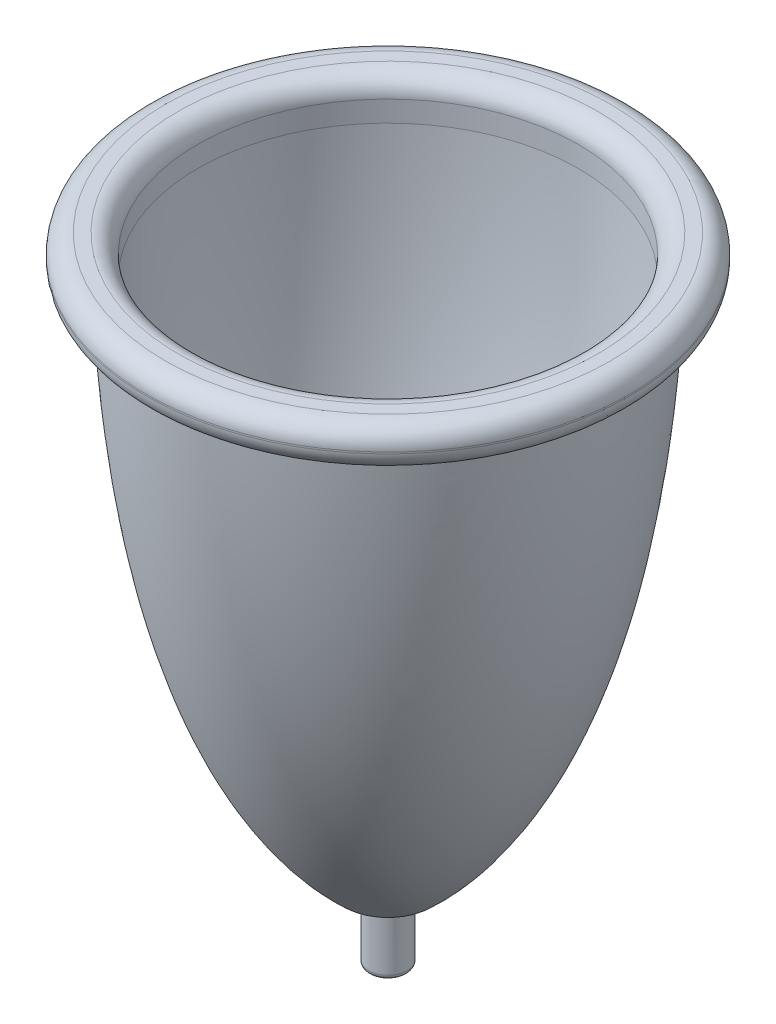
ISO-10303-21;
HEADER;
FILE_DESCRIPTION(('STEP AP214'),'2;1');
FILE_NAME('part.step','',(''),(''),'','','');
FILE_SCHEMA(('AUTOMOTIVE_DESIGN { 1 0 10303 214 1 1 1 1 }'));
ENDSEC;
DATA;
#1=APPLICATION_CONTEXT('core data for automotive mechanical design processes');
#2=APPLICATION_PROTOCOL_DEFINITION('international standard','automotive_design',2000,#1);
#3=PRODUCT_CONTEXT('',#1,'mechanical');
#4=PRODUCT('Part','Part','',(#3));
#5=PRODUCT_RELATED_PRODUCT_CATEGORY('part','',(#4));
#6=PRODUCT_DEFINITION_FORMATION('','',#4);
#7=PRODUCT_DEFINITION_CONTEXT('part definition',#1,'design');
#8=PRODUCT_DEFINITION('design','',#6,#7);
#9=PRODUCT_DEFINITION_SHAPE('','',#8);
#10=(LENGTH_UNIT() NAMED_UNIT(*) SI_UNIT(.MILLI.,.METRE.));
#11=(NAMED_UNIT(*) PLANE_ANGLE_UNIT() SI_UNIT($,.RADIAN.));
#12=(NAMED_UNIT(*) SI_UNIT($,.STERADIAN.) SOLID_ANGLE_UNIT());
#13=UNCERTAINTY_MEASURE_WITH_UNIT(LENGTH_MEASURE(1.E-05),#10,'distance_accuracy_value','');
#14=(GEOMETRIC_REPRESENTATION_CONTEXT(3) GLOBAL_UNCERTAINTY_ASSIGNED_CONTEXT((#13)) GLOBAL_UNIT_ASSIGNED_CONTEXT((#10,
#11,#12)) REPRESENTATION_CONTEXT('',''));
#15=CARTESIAN_POINT('',(0.,0.,0.));
#16=DIRECTION('',(0.,0.,1.));
#17=DIRECTION('',(1.,0.,0.));
#18=AXIS2_PLACEMENT_3D('',#15,#16,#17);
#19=CARTESIAN_POINT('',(0.,55.3992159475314,-21.8706627184148));
#20=CARTESIAN_POINT('',(0.,14.1955587357399,-20.3266568097654));
#21=CARTESIAN_POINT('',(0.,0.,-4.));
#22=B_SPLINE_CURVE_WITH_KNOTS('',2,(#19,#20,#21),.UNSPECIFIED.,.F.,.F.,(3,3),(0.,1.),.UNSPECIFIED.);
#23=CARTESIAN_POINT('',(0.,-7.,0.));
#24=DIRECTION('',(0.,-1.,0.));
#25=AXIS1_PLACEMENT('',#23,#24);
#26=SURFACE_OF_REVOLUTION('',#22,#25);
#27=CARTESIAN_POINT('',(0.,54.3543562152603,0.));
#28=DIRECTION('',(0.,-1.,0.));
#29=DIRECTION('',(0.,0.,-1.));
#30=AXIS2_PLACEMENT_3D('',#27,#28,#29);
#31=CIRCLE('',#30,21.8289486440233);
#32=CARTESIAN_POINT('',(0.,54.3543562152603,-21.8289486440233));
#33=VERTEX_POINT('',#32);
#34=EDGE_CURVE('E40',#33,#33,#31,.T.);
#35=ORIENTED_EDGE('',*,*,#34,.T.);
#36=EDGE_LOOP('',(#35));
#37=FACE_BOUND('',#36,.T.);
#38=CARTESIAN_POINT('',(0.,0.524112621067131,0.));
#39=DIRECTION('',(0.,-1.,0.));
#40=DIRECTION('',(0.,0.,-1.));
#41=AXIS2_PLACEMENT_3D('',#38,#39,#40);
#42=CIRCLE('',#41,4.58769688802162);
#43=CARTESIAN_POINT('',(0.,0.524112621067131,-4.58769688802162));
#44=VERTEX_POINT('',#43);
#45=EDGE_CURVE('E53',#44,#44,#42,.F.);
#46=ORIENTED_EDGE('',*,*,#45,.T.);
#47=EDGE_LOOP('',(#46));
#48=FACE_BOUND('',#47,.T.);
#49=ADVANCED_FACE('F33',(#37,#48),#26,.T.);
#50=CARTESIAN_POINT('',(0.,54.8331780654649,-5.70259197723976E-13));
#51=DIRECTION('',(0.,1.,0.));
#52=DIRECTION('',(0.,0.,1.));
#53=AXIS2_PLACEMENT_3D('',#50,#51,#52);
#54=PLANE('',#53);
#55=CARTESIAN_POINT('',(0.,54.8331780654649,0.));
#56=DIRECTION('',(0.,1.,0.));
#57=DIRECTION('',(0.,0.,1.));
#58=AXIS2_PLACEMENT_3D('',#55,#56,#57);
#59=CIRCLE('',#58,22.3284999286491);
#60=CARTESIAN_POINT('',(0.,54.8331780654649,22.3284999286491));
#61=VERTEX_POINT('',#60);
#62=EDGE_CURVE('E10',#61,#61,#59,.T.);
#63=ORIENTED_EDGE('',*,*,#62,.T.);
#64=EDGE_LOOP('',(#63));
#65=FACE_BOUND('',#64,.T.);
#66=CARTESIAN_POINT('',(0.,54.833178065465,0.));
#67=DIRECTION('',(0.,-1.,0.));
#68=DIRECTION('',(0.,0.,-1.));
#69=AXIS2_PLACEMENT_3D('',#66,#67,#68);
#70=CIRCLE('',#69,23.1470787081715);
#71=CARTESIAN_POINT('',(0.,54.833178065465,-23.1470787081715));
#72=VERTEX_POINT('',#71);
#73=EDGE_CURVE('E59',#72,#72,#70,.T.);
#74=ORIENTED_EDGE('',*,*,#73,.T.);
#75=EDGE_LOOP('',(#74));
#76=FACE_BOUND('',#75,.T.);
#77=ADVANCED_FACE('F127',(#65,#76),#54,.F.);
#78=CARTESIAN_POINT('',(0.,56.833178065465,0.));
#79=DIRECTION('',(0.,-1.,0.));
#80=DIRECTION('',(0.,0.,-1.));
#81=AXIS2_PLACEMENT_3D('',#78,#79,#80);
#82=TOROIDAL_SURFACE('',#81,23.1470787081715,2.);
#83=ORIENTED_EDGE('',*,*,#73,.F.);
#84=EDGE_LOOP('',(#83));
#85=FACE_BOUND('',#84,.T.);
#86=CARTESIAN_POINT('',(0.,56.833178065465,0.));
#87=DIRECTION('',(0.,-1.,0.));
#88=DIRECTION('',(0.,0.,-1.));
#89=AXIS2_PLACEMENT_3D('',#86,#87,#88);
#90=CIRCLE('',#89,25.1470787081715);
#91=CARTESIAN_POINT('',(0.,56.833178065465,-25.1470787081715));
#92=VERTEX_POINT('',#91);
#93=EDGE_CURVE('E62',#92,#92,#90,.T.);
#94=ORIENTED_EDGE('',*,*,#93,.T.);
#95=EDGE_LOOP('',(#94));
#96=FACE_BOUND('',#95,.T.);
#97=ADVANCED_FACE('F123',(#85,#96),#82,.T.);
#98=CARTESIAN_POINT('',(0.,-7.,0.));
#99=DIRECTION('',(0.,-1.,0.));
#100=DIRECTION('',(0.,0.,-1.));
#101=AXIS2_PLACEMENT_3D('',#98,#99,#100);
#102=CYLINDRICAL_SURFACE('',#101,25.1470787081715);
#103=CARTESIAN_POINT('',(0.,57.,0.));
#104=DIRECTION('',(0.,-1.,0.));
#105=DIRECTION('',(0.,0.,-1.));
#106=AXIS2_PLACEMENT_3D('',#103,#104,#105);
#107=CIRCLE('',#106,25.1470787081715);
#108=CARTESIAN_POINT('',(0.,57.,-25.1470787081715));
#109=VERTEX_POINT('',#108);
#110=EDGE_CURVE('E65',#109,#109,#107,.T.);
#111=ORIENTED_EDGE('',*,*,#110,.T.);
#112=EDGE_LOOP('',(#111));
#113=FACE_BOUND('',#112,.T.);
#114=ORIENTED_EDGE('',*,*,#93,.F.);
#115=EDGE_LOOP('',(#114));
#116=FACE_BOUND('',#115,.T.);
#117=ADVANCED_FACE('F119',(#113,#116),#102,.T.);
#118=CARTESIAN_POINT('',(0.,57.,0.));
#119=DIRECTION('',(0.,-1.,0.));
#120=DIRECTION('',(0.,0.,-1.));
#121=AXIS2_PLACEMENT_3D('',#118,#119,#120);
#122=TOROIDAL_SURFACE('',#121,23.1470787081715,2.);
#123=CARTESIAN_POINT('',(0.,59.,0.));
#124=DIRECTION('',(0.,-1.,0.));
#125=DIRECTION('',(0.,0.,-1.));
#126=AXIS2_PLACEMENT_3D('',#123,#124,#125);
#127=CIRCLE('',#126,23.1470787081715);
#128=CARTESIAN_POINT('',(0.,59.,-23.1470787081715));
#129=VERTEX_POINT('',#128);
#130=EDGE_CURVE('E68',#129,#129,#127,.T.);
#131=ORIENTED_EDGE('',*,*,#130,.T.);
#132=EDGE_LOOP('',(#131));
#133=FACE_BOUND('',#132,.T.);
#134=ORIENTED_EDGE('',*,*,#110,.F.);
#135=EDGE_LOOP('',(#134));
#136=FACE_BOUND('',#135,.T.);
#137=ADVANCED_FACE('F115',(#133,#136),#122,.T.);
#138=CARTESIAN_POINT('',(0.,59.,0.));
#139=DIRECTION('',(0.,-1.,0.));
#140=DIRECTION('',(0.,0.,-1.));
#141=AXIS2_PLACEMENT_3D('',#138,#139,#140);
#142=PLANE('',#141);
#143=ORIENTED_EDGE('',*,*,#130,.F.);
#144=EDGE_LOOP('',(#143));
#145=FACE_BOUND('',#144,.T.);
#146=CARTESIAN_POINT('',(0.,59.,0.));
#147=DIRECTION('',(0.,-1.,0.));
#148=DIRECTION('',(0.,0.,-1.));
#149=AXIS2_PLACEMENT_3D('',#146,#147,#148);
#150=CIRCLE('',#149,21.8470787081715);
#151=CARTESIAN_POINT('',(0.,59.,-21.8470787081715));
#152=VERTEX_POINT('',#151);
#153=EDGE_CURVE('E71',#152,#152,#150,.T.);
#154=ORIENTED_EDGE('',*,*,#153,.T.);
#155=EDGE_LOOP('',(#154));
#156=FACE_BOUND('',#155,.T.);
#157=ADVANCED_FACE('F111',(#145,#156),#142,.F.);
#158=CARTESIAN_POINT('',(0.,57.,0.));
#159=DIRECTION('',(0.,-1.,0.));
#160=DIRECTION('',(0.,0.,-1.));
#161=AXIS2_PLACEMENT_3D('',#158,#159,#160);
#162=TOROIDAL_SURFACE('',#161,21.8470787081715,2.);
#163=ORIENTED_EDGE('',*,*,#153,.F.);
#164=EDGE_LOOP('',(#163));
#165=FACE_BOUND('',#164,.T.);
#166=CARTESIAN_POINT('',(0.,57.,0.));
#167=DIRECTION('',(0.,-1.,0.));
#168=DIRECTION('',(0.,0.,-1.));
#169=AXIS2_PLACEMENT_3D('',#166,#167,#168);
#170=CIRCLE('',#169,19.8470787081715);
#171=CARTESIAN_POINT('',(0.,57.,-19.8470787081715));
#172=VERTEX_POINT('',#171);
#173=EDGE_CURVE('E74',#172,#172,#170,.T.);
#174=ORIENTED_EDGE('',*,*,#173,.T.);
#175=EDGE_LOOP('',(#174));
#176=FACE_BOUND('',#175,.T.);
#177=ADVANCED_FACE('F107',(#165,#176),#162,.T.);
#178=CARTESIAN_POINT('',(0.,-7.,0.));
#179=DIRECTION('',(0.,-1.,0.));
#180=DIRECTION('',(0.,0.,-1.));
#181=AXIS2_PLACEMENT_3D('',#178,#179,#180);
#182=CYLINDRICAL_SURFACE('',#181,19.8470787081715);
#183=ORIENTED_EDGE('',*,*,#173,.F.);
#184=EDGE_LOOP('',(#183));
#185=FACE_BOUND('',#184,.T.);
#186=CARTESIAN_POINT('',(0.,54.833178065465,0.));
#187=DIRECTION('',(0.,-1.,0.));
#188=DIRECTION('',(0.,0.,-1.));
#189=AXIS2_PLACEMENT_3D('',#186,#187,#188);
#190=CIRCLE('',#189,19.8470787081715);
#191=CARTESIAN_POINT('',(0.,54.833178065465,-19.8470787081715));
#192=VERTEX_POINT('',#191);
#193=EDGE_CURVE('E77',#192,#192,#190,.T.);
#194=ORIENTED_EDGE('',*,*,#193,.T.);
#195=EDGE_LOOP('',(#194));
#196=FACE_BOUND('',#195,.T.);
#197=ADVANCED_FACE('F102',(#185,#196),#182,.F.);
#198=CARTESIAN_POINT('',(0.,54.833178065465,-19.8470787081715));
#199=CARTESIAN_POINT('',(0.,54.0175401638276,-19.8140408573866));
#200=CARTESIAN_POINT('',(0.,52.3746515404192,-19.7377815935634));
#201=CARTESIAN_POINT('',(0.,49.1868341109516,-19.5504244417606));
#202=CARTESIAN_POINT('',(0.,45.3193799848925,-19.2483111294498));
#203=CARTESIAN_POINT('',(0.,40.8873799013585,-18.7783231518596));
#204=CARTESIAN_POINT('',(0.,35.249773199393,-18.0087211678712));
#205=CARTESIAN_POINT('',(0.,28.7167391183524,-16.7801766602839));
#206=CARTESIAN_POINT('',(0.,21.7015524838969,-14.8852277279257));
#207=CARTESIAN_POINT('',(0.,15.5137307059156,-12.5785372371585));
#208=CARTESIAN_POINT('',(0.,10.1511021048624,-9.86987494169743));
#209=CARTESIAN_POINT('',(0.,6.36846408827015,-7.29301955773348));
#210=CARTESIAN_POINT('',(0.,3.73648207303186,-5.03422818212828));
#211=CARTESIAN_POINT('',(0.,2.56580672981851,-3.85666668593375));
#212=CARTESIAN_POINT('',(0.,2.00000000000053,-3.23797230696625));
#213=B_SPLINE_CURVE_WITH_KNOTS('',3,(#198,#199,#200,#201,#202,#203,#204,#205,#206,#207,#208,
#209,#210,#211,#212),.UNSPECIFIED.,.F.,.F.,(4,1,1,1,1,1,1,1,1,1,1,1,4),(0.00787133947068672,
0.0383082611722949,0.068745182873903,0.129619026277119,0.190492869680336,0.251366713083552,
0.373114399889985,0.494862086696417,0.61660977350285,0.738357460309282,0.860105147115715,
0.920978990518931,0.981852833922148),.UNSPECIFIED.);
#214=CARTESIAN_POINT('',(0.,-7.,0.));
#215=DIRECTION('',(0.,-1.,0.));
#216=AXIS1_PLACEMENT('',#214,#215);
#217=SURFACE_OF_REVOLUTION('',#213,#216);
#218=CARTESIAN_POINT('',(0.,2.00000000000053,0.));
#219=DIRECTION('',(0.,-1.,0.));
#220=DIRECTION('',(0.,0.,-1.));
#221=AXIS2_PLACEMENT_3D('',#218,#219,#220);
#222=CIRCLE('',#221,3.23797230696625);
#223=CARTESIAN_POINT('',(0.,2.00000000000053,-3.23797230696625));
#224=VERTEX_POINT('',#223);
#225=EDGE_CURVE('E80',#224,#224,#222,.T.);
#226=ORIENTED_EDGE('',*,*,#225,.T.);
#227=EDGE_LOOP('',(#226));
#228=FACE_BOUND('',#227,.T.);
#229=ORIENTED_EDGE('',*,*,#193,.F.);
#230=EDGE_LOOP('',(#229));
#231=FACE_BOUND('',#230,.T.);
#232=ADVANCED_FACE('F97',(#228,#231),#217,.F.);
#233=CARTESIAN_POINT('',(0.,2.00000000000026,3.27071568773266E-13));
#234=DIRECTION('',(0.,-1.,0.));
#235=DIRECTION('',(0.,0.,-1.));
#236=AXIS2_PLACEMENT_3D('',#233,#234,#235);
#237=PLANE('',#236);
#238=ORIENTED_EDGE('',*,*,#225,.F.);
#239=EDGE_LOOP('',(#238));
#240=FACE_BOUND('',#239,.T.);
#241=ADVANCED_FACE('F101',(#240),#237,.F.);
#242=CARTESIAN_POINT('',(0.,-7.,0.));
#243=DIRECTION('',(0.,1.,0.));
#244=DIRECTION('',(0.,0.,1.));
#245=AXIS2_PLACEMENT_3D('',#242,#243,#244);
#246=PLANE('',#245);
#247=CARTESIAN_POINT('',(0.,-7.,0.));
#248=DIRECTION('',(0.,1.,0.));
#249=DIRECTION('',(0.,0.,1.));
#250=AXIS2_PLACEMENT_3D('',#247,#248,#249);
#251=CIRCLE('',#250,1.5);
#252=CARTESIAN_POINT('',(0.,-7.,1.5));
#253=VERTEX_POINT('',#252);
#254=EDGE_CURVE('E48',#253,#253,#251,.F.);
#255=ORIENTED_EDGE('',*,*,#254,.T.);
#256=EDGE_LOOP('',(#255));
#257=FACE_BOUND('',#256,.T.);
#258=ADVANCED_FACE('F148',(#257),#246,.F.);
#259=CARTESIAN_POINT('',(0.,-7.,0.));
#260=DIRECTION('',(0.,-1.,0.));
#261=DIRECTION('',(0.,0.,-1.));
#262=AXIS2_PLACEMENT_3D('',#259,#260,#261);
#263=CYLINDRICAL_SURFACE('',#262,2.);
#264=CARTESIAN_POINT('',(0.,-6.5,0.));
#265=DIRECTION('',(0.,1.,0.));
#266=DIRECTION('',(0.,0.,1.));
#267=AXIS2_PLACEMENT_3D('',#264,#265,#266);
#268=CIRCLE('',#267,2.);
#269=CARTESIAN_POINT('',(0.,-6.5,2.));
#270=VERTEX_POINT('',#269);
#271=EDGE_CURVE('E44',#270,#270,#268,.T.);
#272=ORIENTED_EDGE('',*,*,#271,.T.);
#273=EDGE_LOOP('',(#272));
#274=FACE_BOUND('',#273,.T.);
#275=CARTESIAN_POINT('',(0.,0.,0.));
#276=DIRECTION('',(0.,-1.,0.));
#277=DIRECTION('',(0.,0.,-1.));
#278=AXIS2_PLACEMENT_3D('',#275,#276,#277);
#279=CIRCLE('',#278,2.00000000000001);
#280=CARTESIAN_POINT('',(0.,0.,-2.00000000000001));
#281=VERTEX_POINT('',#280);
#282=EDGE_CURVE('E83',#281,#281,#279,.T.);
#283=ORIENTED_EDGE('',*,*,#282,.T.);
#284=EDGE_LOOP('',(#283));
#285=FACE_BOUND('',#284,.T.);
#286=ADVANCED_FACE('F150',(#274,#285),#263,.T.);
#287=CARTESIAN_POINT('',(0.,0.,0.));
#288=DIRECTION('',(0.,-1.,0.));
#289=DIRECTION('',(0.,0.,-1.));
#290=AXIS2_PLACEMENT_3D('',#287,#288,#289);
#291=PLANE('',#290);
#292=CARTESIAN_POINT('',(0.,0.,0.));
#293=DIRECTION('',(0.,-1.,0.));
#294=DIRECTION('',(0.,0.,-1.));
#295=AXIS2_PLACEMENT_3D('',#292,#293,#294);
#296=CIRCLE('',#295,3.23797230696567);
#297=CARTESIAN_POINT('',(0.,0.,-3.23797230696567));
#298=VERTEX_POINT('',#297);
#299=EDGE_CURVE('E56',#298,#298,#296,.T.);
#300=ORIENTED_EDGE('',*,*,#299,.T.);
#301=EDGE_LOOP('',(#300));
#302=FACE_BOUND('',#301,.T.);
#303=ORIENTED_EDGE('',*,*,#282,.F.);
#304=EDGE_LOOP('',(#303));
#305=FACE_BOUND('',#304,.T.);
#306=ADVANCED_FACE('F136',(#302,#305),#291,.T.);
#307=CARTESIAN_POINT('',(0.,2.,0.));
#308=DIRECTION('',(0.,-1.,0.));
#309=DIRECTION('',(0.,0.,-1.));
#310=AXIS2_PLACEMENT_3D('',#307,#308,#309);
#311=TOROIDAL_SURFACE('',#310,3.23797230696567,2.);
#312=ORIENTED_EDGE('',*,*,#45,.F.);
#313=EDGE_LOOP('',(#312));
#314=FACE_BOUND('',#313,.T.);
#315=ORIENTED_EDGE('',*,*,#299,.F.);
#316=EDGE_LOOP('',(#315));
#317=FACE_BOUND('',#316,.T.);
#318=ADVANCED_FACE('F133',(#314,#317),#311,.T.);
#319=CARTESIAN_POINT('',(0.,-6.5,0.));
#320=DIRECTION('',(0.,1.,0.));
#321=DIRECTION('',(0.,0.,1.));
#322=AXIS2_PLACEMENT_3D('',#319,#320,#321);
#323=TOROIDAL_SURFACE('',#322,1.5,0.5);
#324=ORIENTED_EDGE('',*,*,#271,.F.);
#325=EDGE_LOOP('',(#324));
#326=FACE_BOUND('',#325,.T.);
#327=ORIENTED_EDGE('',*,*,#254,.F.);
#328=EDGE_LOOP('',(#327));
#329=FACE_BOUND('',#328,.T.);
#330=ADVANCED_FACE('F135',(#326,#329),#323,.T.);
#331=CARTESIAN_POINT('',(0.,54.3331780654649,0.));
#332=DIRECTION('',(0.,-1.,0.));
#333=DIRECTION('',(0.,0.,-1.));
#334=AXIS2_PLACEMENT_3D('',#331,#332,#333);
#335=TOROIDAL_SURFACE('',#334,22.3284999286491,0.5);
#336=ORIENTED_EDGE('',*,*,#62,.F.);
#337=EDGE_LOOP('',(#336));
#338=FACE_BOUND('',#337,.T.);
#339=ORIENTED_EDGE('',*,*,#34,.F.);
#340=EDGE_LOOP('',(#339));
#341=FACE_BOUND('',#340,.T.);
#342=ADVANCED_FACE('F35',(#338,#341),#335,.F.);
#343=CLOSED_SHELL('',(#49,#77,#97,#117,#137,#157,#177,#197,#232,#241,#258,#286,#306,#318,#330,#342));
#344=MANIFOLD_SOLID_BREP('B2',#343);
#345=ADVANCED_BREP_SHAPE_REPRESENTATION('',(#18,#344),#14);
#346=SHAPE_DEFINITION_REPRESENTATION(#9,#345);
ENDSEC;
END-ISO-10303-21;
